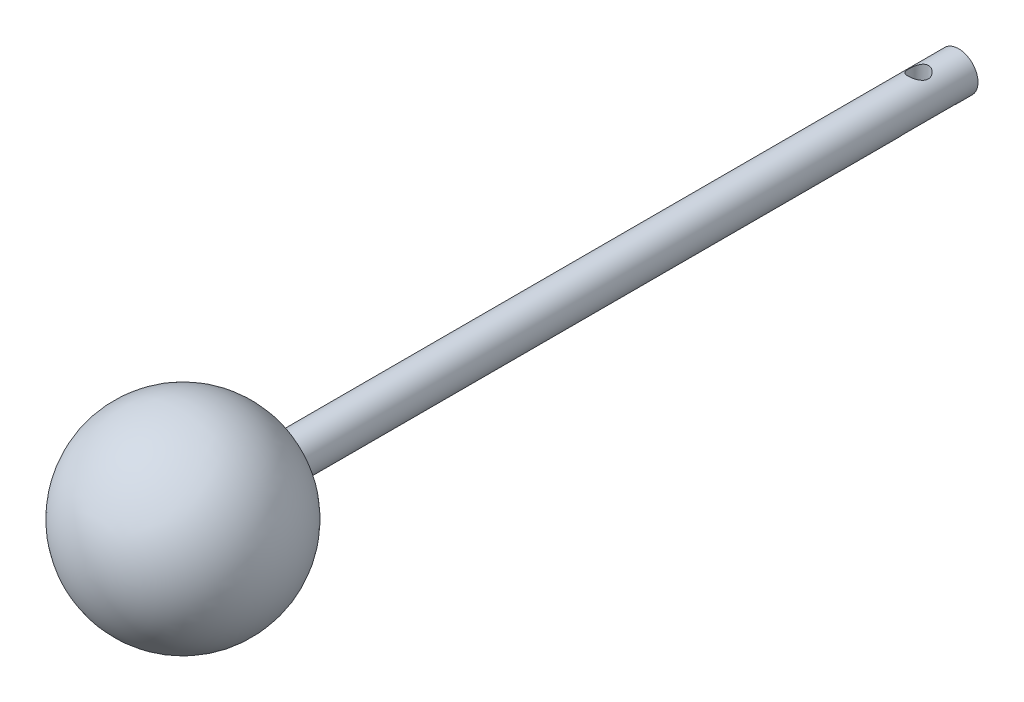
ISO-10303-21;
HEADER;
FILE_DESCRIPTION(('STEP AP214'),'2;1');
FILE_NAME('part.step','',(''),(''),'','','');
FILE_SCHEMA(('AUTOMOTIVE_DESIGN { 1 0 10303 214 1 1 1 1 }'));
ENDSEC;
DATA;
#1=APPLICATION_CONTEXT('core data for automotive mechanical design processes');
#2=APPLICATION_PROTOCOL_DEFINITION('international standard','automotive_design',2000,#1);
#3=PRODUCT_CONTEXT('',#1,'mechanical');
#4=PRODUCT('Part','Part','',(#3));
#5=PRODUCT_RELATED_PRODUCT_CATEGORY('part','',(#4));
#6=PRODUCT_DEFINITION_FORMATION('','',#4);
#7=PRODUCT_DEFINITION_CONTEXT('part definition',#1,'design');
#8=PRODUCT_DEFINITION('design','',#6,#7);
#9=PRODUCT_DEFINITION_SHAPE('','',#8);
#10=(LENGTH_UNIT() NAMED_UNIT(*) SI_UNIT(.MILLI.,.METRE.));
#11=(NAMED_UNIT(*) PLANE_ANGLE_UNIT() SI_UNIT($,.RADIAN.));
#12=(NAMED_UNIT(*) SI_UNIT($,.STERADIAN.) SOLID_ANGLE_UNIT());
#13=UNCERTAINTY_MEASURE_WITH_UNIT(LENGTH_MEASURE(1.E-05),#10,'distance_accuracy_value','');
#14=(GEOMETRIC_REPRESENTATION_CONTEXT(3) GLOBAL_UNCERTAINTY_ASSIGNED_CONTEXT((#13)) GLOBAL_UNIT_ASSIGNED_CONTEXT((#10,
#11,#12)) REPRESENTATION_CONTEXT('',''));
#15=CARTESIAN_POINT('',(0.,0.,0.));
#16=DIRECTION('',(0.,0.,1.));
#17=DIRECTION('',(1.,0.,0.));
#18=AXIS2_PLACEMENT_3D('',#15,#16,#17);
#19=CARTESIAN_POINT('',(-4.74113189811159,-3.,3.96323828942932));
#20=DIRECTION('',(0.,0.,-1.));
#21=DIRECTION('',(0.,-1.,0.));
#22=AXIS2_PLACEMENT_3D('',#19,#20,#21);
#23=PLANE('',#22);
#24=DIRECTION('',(1.,0.,0.));
#25=VECTOR('',#24,1.);
#26=CARTESIAN_POINT('',(-4.74113189811159,-3.,3.96323828942932));
#27=LINE('',#26,#25);
#28=CARTESIAN_POINT('',(-4.,-3.,3.96323828942932));
#29=VERTEX_POINT('',#28);
#30=CARTESIAN_POINT('',(4.,-3.,3.96323828942932));
#31=VERTEX_POINT('',#30);
#32=EDGE_CURVE('E10',#29,#31,#27,.T.);
#33=ORIENTED_EDGE('',*,*,#32,.F.);
#34=CARTESIAN_POINT('',(0.,0.,3.96323828942932));
#35=DIRECTION('',(0.,0.,1.));
#36=DIRECTION('',(-1.,0.,0.));
#37=AXIS2_PLACEMENT_3D('',#34,#35,#36);
#38=CIRCLE('',#37,5.);
#39=EDGE_CURVE('E78',#29,#31,#38,.T.);
#40=ORIENTED_EDGE('',*,*,#39,.T.);
#41=EDGE_LOOP('',(#33,#40));
#42=FACE_BOUND('',#41,.T.);
#43=ADVANCED_FACE('F16',(#42),#23,.F.);
#44=CARTESIAN_POINT('',(4.87669310872114,-3.,18.7551714697627));
#45=DIRECTION('',(0.,0.,1.));
#46=DIRECTION('',(1.,0.,0.));
#47=AXIS2_PLACEMENT_3D('',#44,#45,#46);
#48=PLANE('',#47);
#49=CARTESIAN_POINT('',(0.,0.,18.7551714697627));
#50=DIRECTION('',(0.,0.,-1.));
#51=DIRECTION('',(1.,0.,0.));
#52=AXIS2_PLACEMENT_3D('',#49,#50,#51);
#53=CIRCLE('',#52,5.);
#54=CARTESIAN_POINT('',(4.,-3.,18.7551714697627));
#55=VERTEX_POINT('',#54);
#56=CARTESIAN_POINT('',(-4.,-3.,18.7551714697627));
#57=VERTEX_POINT('',#56);
#58=EDGE_CURVE('E80',#55,#57,#53,.T.);
#59=ORIENTED_EDGE('',*,*,#58,.T.);
#60=DIRECTION('',(-1.,0.,0.));
#61=VECTOR('',#60,1.);
#62=CARTESIAN_POINT('',(4.87669310872114,-3.,18.7551714697627));
#63=LINE('',#62,#61);
#64=EDGE_CURVE('E29',#55,#57,#63,.T.);
#65=ORIENTED_EDGE('',*,*,#64,.F.);
#66=EDGE_LOOP('',(#59,#65));
#67=FACE_BOUND('',#66,.T.);
#68=ADVANCED_FACE('F81',(#67),#48,.F.);
#69=CARTESIAN_POINT('',(0.,-3.,0.));
#70=DIRECTION('',(0.,-1.,0.));
#71=DIRECTION('',(0.,0.,-1.));
#72=AXIS2_PLACEMENT_3D('',#69,#70,#71);
#73=PLANE('',#72);
#74=CARTESIAN_POINT('',(-0.273544519554993,-3.,10.1273674912475));
#75=DIRECTION('',(0.,1.,0.));
#76=DIRECTION('',(-1.,0.,0.));
#77=AXIS2_PLACEMENT_3D('',#74,#75,#76);
#78=ELLIPSE('',#77,2.50009360226849,2.5);
#79=CARTESIAN_POINT('',(-2.77363812182348,-3.,10.1273674912475));
#80=VERTEX_POINT('',#79);
#81=EDGE_CURVE('E97',#80,#80,#78,.T.);
#82=ORIENTED_EDGE('',*,*,#81,.T.);
#83=EDGE_LOOP('',(#82));
#84=FACE_BOUND('',#83,.T.);
#85=ORIENTED_EDGE('',*,*,#64,.T.);
#86=DIRECTION('',(0.,0.,1.));
#87=VECTOR('',#86,1.);
#88=CARTESIAN_POINT('',(-4.,-3.,-20.));
#89=LINE('',#88,#87);
#90=EDGE_CURVE('E72',#29,#57,#89,.T.);
#91=ORIENTED_EDGE('',*,*,#90,.F.);
#92=ORIENTED_EDGE('',*,*,#32,.T.);
#93=DIRECTION('',(0.,0.,-1.));
#94=VECTOR('',#93,1.);
#95=CARTESIAN_POINT('',(4.,-3.,-20.));
#96=LINE('',#95,#94);
#97=EDGE_CURVE('E74',#55,#31,#96,.T.);
#98=ORIENTED_EDGE('',*,*,#97,.F.);
#99=EDGE_LOOP('',(#85,#91,#92,#98));
#100=FACE_BOUND('',#99,.T.);
#101=ADVANCED_FACE('F18',(#84,#100),#73,.T.);
#102=CARTESIAN_POINT('',(0.,0.,-20.));
#103=DIRECTION('',(0.,0.,1.));
#104=DIRECTION('',(1.,0.,0.));
#105=AXIS2_PLACEMENT_3D('',#102,#103,#104);
#106=CYLINDRICAL_SURFACE('',#105,5.);
#107=CARTESIAN_POINT('',(0.,0.,175.505102572168));
#108=DIRECTION('',(0.,0.,1.));
#109=DIRECTION('',(1.,0.,0.));
#110=AXIS2_PLACEMENT_3D('',#107,#108,#109);
#111=CIRCLE('',#110,5.);
#112=CARTESIAN_POINT('',(5.,0.,175.505102572168));
#113=VERTEX_POINT('',#112);
#114=EDGE_CURVE('E87',#113,#113,#111,.T.);
#115=ORIENTED_EDGE('',*,*,#114,.F.);
#116=EDGE_LOOP('',(#115));
#117=FACE_BOUND('',#116,.T.);
#118=CARTESIAN_POINT('',(0.,0.,0.));
#119=DIRECTION('',(0.,0.,1.));
#120=DIRECTION('',(1.,0.,0.));
#121=AXIS2_PLACEMENT_3D('',#118,#119,#120);
#122=CIRCLE('',#121,5.);
#123=CARTESIAN_POINT('',(5.,0.,0.));
#124=VERTEX_POINT('',#123);
#125=EDGE_CURVE('E93',#124,#124,#122,.T.);
#126=ORIENTED_EDGE('',*,*,#125,.T.);
#127=EDGE_LOOP('',(#126));
#128=FACE_BOUND('',#127,.T.);
#129=CARTESIAN_POINT('',(2.29096807088509,4.44426206452619,10.1273674912475));
#130=CARTESIAN_POINT('',(2.29097027187872,4.44437638864499,10.0904048012969));
#131=CARTESIAN_POINT('',(2.29015475688964,4.4450003404971,10.0534461855536));
#132=CARTESIAN_POINT('',(2.28684216180662,4.44721746007607,9.97838359858996));
#133=CARTESIAN_POINT('',(2.28428933058905,4.44884258663657,9.9402830094962));
#134=CARTESIAN_POINT('',(2.27734172905094,4.45306227829104,9.86302563543784));
#135=CARTESIAN_POINT('',(2.27288861529391,4.45568723998433,9.82387578507373));
#136=CARTESIAN_POINT('',(2.26198158243105,4.46190995600956,9.74462277493384));
#137=CARTESIAN_POINT('',(2.25546706801254,4.46553668131556,9.70453023936022));
#138=CARTESIAN_POINT('',(2.24027908942118,4.47376647829459,9.62351213583029));
#139=CARTESIAN_POINT('',(2.23154305850821,4.47839714387939,9.58260111636345));
#140=CARTESIAN_POINT('',(2.21175622494379,4.48863381284672,9.50008259397428));
#141=CARTESIAN_POINT('',(2.20064118434847,4.49426594108972,9.45849373614737));
#142=CARTESIAN_POINT('',(2.17594671653291,4.50652299707374,9.37477821080143));
#143=CARTESIAN_POINT('',(2.16230176769901,4.51317321920018,9.33267461706599));
#144=CARTESIAN_POINT('',(2.13239679940392,4.52741099606083,9.24809168936194));
#145=CARTESIAN_POINT('',(2.11607010119879,4.53502083732476,9.20563958813183));
#146=CARTESIAN_POINT('',(2.08873837729159,4.54767834781354,9.13994971154055));
#147=CARTESIAN_POINT('',(2.07848254998998,4.55241214490316,9.11633632850894));
#148=CARTESIAN_POINT('',(2.05546291356246,4.562976251653,9.06549104912489));
#149=CARTESIAN_POINT('',(2.04256947479321,4.56885598685266,9.0383279335775));
#150=CARTESIAN_POINT('',(2.01388477010988,4.58169761049992,8.98060367758997));
#151=CARTESIAN_POINT('',(1.99794493110527,4.58869240068173,8.95012371959596));
#152=CARTESIAN_POINT('',(1.96273748497673,4.60378717978528,8.88605311771569));
#153=CARTESIAN_POINT('',(1.94330445394091,4.61191460865653,8.85255972636785));
#154=CARTESIAN_POINT('',(1.90064638400019,4.62928097181163,8.7828207136445));
#155=CARTESIAN_POINT('',(1.87724088672117,4.63854185067378,8.74669094582312));
#156=CARTESIAN_POINT('',(1.82614862397464,4.65818563063851,8.67211846945943));
#157=CARTESIAN_POINT('',(1.798268393081,4.66858708354079,8.63381272197418));
#158=CARTESIAN_POINT('',(1.75386933297298,4.68467201890571,8.57632126236301));
#159=CARTESIAN_POINT('',(1.73810189265203,4.69029824942895,8.55653423582525));
#160=CARTESIAN_POINT('',(1.70528639927766,4.70183691533213,8.51661374817765));
#161=CARTESIAN_POINT('',(1.68821243948283,4.70775124010688,8.49650207601029));
#162=CARTESIAN_POINT('',(1.6527229010513,4.71986156453604,8.45601762125972));
#163=CARTESIAN_POINT('',(1.63428103617855,4.72605911014308,8.43566835378258));
#164=CARTESIAN_POINT('',(1.5959997952171,4.73875606425283,8.39480387639068));
#165=CARTESIAN_POINT('',(1.57613400131619,4.74525769646351,8.37431409256095));
#166=CARTESIAN_POINT('',(1.53777789007654,4.75757383234399,8.33608880792879));
#167=CARTESIAN_POINT('',(1.51935513923773,4.76339049773061,8.31828617699927));
#168=CARTESIAN_POINT('',(1.4824762922704,4.77476888870651,8.28373331581397));
#169=CARTESIAN_POINT('',(1.46403549038959,4.78033319782421,8.26696758003004));
#170=CARTESIAN_POINT('',(1.4095609163737,4.79643115559803,8.21891562299686));
#171=CARTESIAN_POINT('',(1.37284739469889,4.8068600403643,8.18835855627408));
#172=CARTESIAN_POINT('',(1.29991703669441,4.82673691565651,8.13113045286886));
#173=CARTESIAN_POINT('',(1.26380236560522,4.83620622983469,8.10433627125596));
#174=CARTESIAN_POINT('',(1.19245449803386,4.85416172486003,8.05434316267399));
#175=CARTESIAN_POINT('',(1.15731171656263,4.86267210638991,8.03102393935415));
#176=CARTESIAN_POINT('',(1.08824433431877,4.87870349946571,7.98768313399319));
#177=CARTESIAN_POINT('',(1.05439923817867,4.88625244366949,7.96754514612932));
#178=CARTESIAN_POINT('',(0.988215223418597,4.90035155557564,7.93026560462086));
#179=CARTESIAN_POINT('',(0.955946013706783,4.90693442644957,7.91301263896047));
#180=CARTESIAN_POINT('',(0.893159860872016,4.91910481668146,7.88120596743481));
#181=CARTESIAN_POINT('',(0.86270373675081,4.92472991122281,7.86654668575605));
#182=CARTESIAN_POINT('',(0.803745754480453,4.93494192289116,7.83963655047852));
#183=CARTESIAN_POINT('',(0.775297185226141,4.93957642716842,7.82728687764598));
#184=CARTESIAN_POINT('',(0.706945724162001,4.94998065001827,7.79912427935863));
#185=CARTESIAN_POINT('',(0.666809611499359,4.95550984223701,7.78378527450628));
#186=CARTESIAN_POINT('',(0.586199507854663,4.96561456201617,7.75534961738333));
#187=CARTESIAN_POINT('',(0.54573580366146,4.97020101929393,7.74222762235487));
#188=CARTESIAN_POINT('',(0.464591068621443,4.97837673589085,7.71819392887311));
#189=CARTESIAN_POINT('',(0.423918501121329,4.98197732250385,7.70725755077625));
#190=CARTESIAN_POINT('',(0.342480749205181,4.98819157723667,7.68756010707831));
#191=CARTESIAN_POINT('',(0.301722187372839,4.99081627458129,7.67877514021755));
#192=CARTESIAN_POINT('',(0.22022938307357,4.99507496124411,7.66333830308543));
#193=CARTESIAN_POINT('',(0.179500059918453,4.99671979967076,7.65666347289277));
#194=CARTESIAN_POINT('',(0.0981777185691262,4.99901892274448,7.645399249595));
#195=CARTESIAN_POINT('',(0.0575880321116918,4.99968378153604,7.64078797408039));
#196=CARTESIAN_POINT('',(-0.023348886374839,5.00002174400196,7.63359792781819));
#197=CARTESIAN_POINT('',(-0.0636942375815496,4.99970510976384,7.630998478676));
#198=CARTESIAN_POINT('',(-0.144042478576137,4.99808100147773,7.62777451322916));
#199=CARTESIAN_POINT('',(-0.184044788466749,4.99678340266519,7.627130632565));
#200=CARTESIAN_POINT('',(-0.26331707943675,4.99320517096368,7.62775361926741));
#201=CARTESIAN_POINT('',(-0.302588079419665,4.99094140915315,7.62898858643345));
#202=CARTESIAN_POINT('',(-0.381600041078189,4.98543144533972,7.63333334837346));
#203=CARTESIAN_POINT('',(-0.421338269045822,4.98216987579663,7.63647328432323));
#204=CARTESIAN_POINT('',(-0.501189609093607,4.97466479607194,7.64470000659985));
#205=CARTESIAN_POINT('',(-0.541298040393421,4.97040592746277,7.64981815466014));
#206=CARTESIAN_POINT('',(-0.621787425057906,4.96090516564412,7.66206938193969));
#207=CARTESIAN_POINT('',(-0.662161630563923,4.95564795493803,7.66923487778318));
#208=CARTESIAN_POINT('',(-0.743072681884366,4.94414883999293,7.68564419694431));
#209=CARTESIAN_POINT('',(-0.783600602225478,4.937891700514,7.69492131465682));
#210=CARTESIAN_POINT('',(-0.864702855641782,4.92439439850425,7.71561244546104));
#211=CARTESIAN_POINT('',(-0.905266007942056,4.91713918518987,7.72706045416711));
#212=CARTESIAN_POINT('',(-0.98631196427087,4.90163363855943,7.7521444462965));
#213=CARTESIAN_POINT('',(-1.0267811939483,4.89336823894978,7.76581490870625));
#214=CARTESIAN_POINT('',(-1.10751866137676,4.8758825798655,7.79539430601673));
#215=CARTESIAN_POINT('',(-1.14777109404844,4.86664818534067,7.8113381120341));
#216=CARTESIAN_POINT('',(-1.21498121535791,4.85022076781346,7.83997994990063));
#217=CARTESIAN_POINT('',(-1.24221848486375,4.84327396517133,7.85216707805984));
#218=CARTESIAN_POINT('',(-1.29892288286051,4.82822522961965,7.87875617326114));
#219=CARTESIAN_POINT('',(-1.32833166554534,4.82007794066709,7.89325705682468));
#220=CARTESIAN_POINT('',(-1.38919254084527,4.80264653575239,7.92475689461217));
#221=CARTESIAN_POINT('',(-1.42057922230812,4.79332728084682,7.94186268710749));
#222=CARTESIAN_POINT('',(-1.48516429414427,4.77353470754872,7.97886509197857));
#223=CARTESIAN_POINT('',(-1.51828827256743,4.76303082657145,7.99887527677607));
#224=CARTESIAN_POINT('',(-1.58607550134313,4.74086545916053,8.04198809252145));
#225=CARTESIAN_POINT('',(-1.62065431225753,4.72917798376498,8.06521015530437));
#226=CARTESIAN_POINT('',(-1.69102944269022,4.70463385102973,8.11504854818224));
#227=CARTESIAN_POINT('',(-1.72672992954157,4.69175418779594,8.14178890955388));
#228=CARTESIAN_POINT('',(-1.79897952699599,4.66483678735649,8.19896511909566));
#229=CARTESIAN_POINT('',(-1.83542055637113,4.65077996189387,8.22952862248566));
#230=CARTESIAN_POINT('',(-1.90870805551039,4.62143111212679,8.29461909345997));
#231=CARTESIAN_POINT('',(-1.94543181590927,4.60611753192481,8.32927452672471));
#232=CARTESIAN_POINT('',(-2.01824309001192,4.57480427274336,8.40225611521151));
#233=CARTESIAN_POINT('',(-2.05423629224352,4.55880324906413,8.44067585825698));
#234=CARTESIAN_POINT('',(-2.12136739178042,4.52823089758408,8.51702087136553));
#235=CARTESIAN_POINT('',(-2.15266883661614,4.5136376983926,8.5547936927238));
#236=CARTESIAN_POINT('',(-2.21078331929939,4.48580259497332,8.62927467414137));
#237=CARTESIAN_POINT('',(-2.23775692553242,4.4725413957942,8.66585040166208));
#238=CARTESIAN_POINT('',(-2.28761879477652,4.4473979032831,8.7374690168262));
#239=CARTESIAN_POINT('',(-2.31066099827371,4.435490921203,8.77239611457193));
#240=CARTESIAN_POINT('',(-2.35306042579697,4.41305715542778,8.84031663103857));
#241=CARTESIAN_POINT('',(-2.37256346025103,4.40250117764058,8.87320941025943));
#242=CARTESIAN_POINT('',(-2.40827894534333,4.38278478685676,8.93672927209357));
#243=CARTESIAN_POINT('',(-2.4246273188275,4.37358800360464,8.96726867692386));
#244=CARTESIAN_POINT('',(-2.45440962132872,4.35658350043946,9.02580421445821));
#245=CARTESIAN_POINT('',(-2.46796840563817,4.34873226334206,9.05372408537773));
#246=CARTESIAN_POINT('',(-2.49252992339022,4.33448529821161,9.10680848345417));
#247=CARTESIAN_POINT('',(-2.50364466818968,4.32802763998937,9.1319046402947));
#248=CARTESIAN_POINT('',(-2.53144675002812,4.31188092610146,9.1976014819507));
#249=CARTESIAN_POINT('',(-2.54752034074956,4.30255218535489,9.23855293335427));
#250=CARTESIAN_POINT('',(-2.57719116918176,4.28509656647381,9.32048492226621));
#251=CARTESIAN_POINT('',(-2.5908368448043,4.27694698720009,9.36144314429686));
#252=CARTESIAN_POINT('',(-2.61574099260299,4.26192293182004,9.44325404152996));
#253=CARTESIAN_POINT('',(-2.62704701619136,4.25502350890644,9.48408761425698));
#254=CARTESIAN_POINT('',(-2.64735933409088,4.24248256004535,9.56550341164948));
#255=CARTESIAN_POINT('',(-2.65641217091498,4.23681594804021,9.60607015275378));
#256=CARTESIAN_POINT('',(-2.67231411177896,4.22674676140041,9.68682340871795));
#257=CARTESIAN_POINT('',(-2.67920837951855,4.22231852325495,9.72699781045202));
#258=CARTESIAN_POINT('',(-2.6908937352339,4.21472625090517,9.80684711727806));
#259=CARTESIAN_POINT('',(-2.6957283126412,4.21153621698888,9.84651317059802));
#260=CARTESIAN_POINT('',(-2.70339917595879,4.20642151780614,9.92523776162635));
#261=CARTESIAN_POINT('',(-2.70627697606141,4.20447062663193,9.96429053515205));
#262=CARTESIAN_POINT('',(-2.71014235919959,4.20183660616126,10.041691440902));
#263=CARTESIAN_POINT('',(-2.71116920002661,4.20112715637405,10.0800366992115));
#264=CARTESIAN_POINT('',(-2.71144706277495,4.20096985269273,10.1570031544269));
#265=CARTESIAN_POINT('',(-2.7106856771221,4.20153081254668,10.1956244146287));
#266=CARTESIAN_POINT('',(-2.707331816848,4.2038739270316,10.27356869332));
#267=CARTESIAN_POINT('',(-2.70470094354513,4.20568166681373,10.3128892717578));
#268=CARTESIAN_POINT('',(-2.69750611579064,4.2105186862893,10.3921400292606));
#269=CARTESIAN_POINT('',(-2.69290147825547,4.21357360585944,10.4320649366185));
#270=CARTESIAN_POINT('',(-2.68165991055768,4.22090345711632,10.5124217672246));
#271=CARTESIAN_POINT('',(-2.67498029107071,4.22520387361731,10.5528453788687));
#272=CARTESIAN_POINT('',(-2.65949340194463,4.23502541055828,10.6340863107904));
#273=CARTESIAN_POINT('',(-2.65064173556476,4.24057176699779,10.6748920981385));
#274=CARTESIAN_POINT('',(-2.63071946301245,4.25287987285514,10.7567749141856));
#275=CARTESIAN_POINT('',(-2.61960304759152,4.25966635397161,10.7978370728223));
#276=CARTESIAN_POINT('',(-2.5950678836595,4.27447293497336,10.8800937907121));
#277=CARTESIAN_POINT('',(-2.5816022825848,4.28251770457349,10.9212698887743));
#278=CARTESIAN_POINT('',(-2.55228340943907,4.29976910127893,11.003626841033));
#279=CARTESIAN_POINT('',(-2.5363823672122,4.30899818513593,11.0447860470026));
#280=CARTESIAN_POINT('',(-2.50877818339439,4.32504151077424,11.1109869314259));
#281=CARTESIAN_POINT('',(-2.49768915307287,4.33149133426336,11.1363754157407));
#282=CARTESIAN_POINT('',(-2.47318525733593,4.34572928607096,11.1900329857457));
#283=CARTESIAN_POINT('',(-2.45965759213139,4.35358108678266,11.2182337364967));
#284=CARTESIAN_POINT('',(-2.42994189831535,4.37059151376138,11.2773201258799));
#285=CARTESIAN_POINT('',(-2.41362834467549,4.37979497734012,11.3081296260927));
#286=CARTESIAN_POINT('',(-2.37798552762949,4.39953035273281,11.3721789238253));
#287=CARTESIAN_POINT('',(-2.35851978315314,4.41009983251106,11.4053312301168));
#288=CARTESIAN_POINT('',(-2.31619694374286,4.43256618009679,11.4737604137246));
#289=CARTESIAN_POINT('',(-2.29319357836316,4.44449326813821,11.5089369247761));
#290=CARTESIAN_POINT('',(-2.24341071992669,4.46968279174129,11.5810443937181));
#291=CARTESIAN_POINT('',(-2.21647691385014,4.48297081826416,11.6178599252527));
#292=CARTESIAN_POINT('',(-2.15844295941337,4.51086531631228,11.6928111738383));
#293=CARTESIAN_POINT('',(-2.12718194625725,4.52549187166096,11.7308149217926));
#294=CARTESIAN_POINT('',(-2.06013258796014,4.55613746157326,11.8076130232298));
#295=CARTESIAN_POINT('',(-2.02418045921212,4.57217907792735,11.8462554897636));
#296=CARTESIAN_POINT('',(-1.95149371014832,4.6035530378374,11.9196054785906));
#297=CARTESIAN_POINT('',(-1.91485789673842,4.61888644566769,11.9544105406946));
#298=CARTESIAN_POINT('',(-1.84174480934777,4.64827486559829,12.0197822883608));
#299=CARTESIAN_POINT('',(-1.80539143739123,4.6623511776615,12.050477995976));
#300=CARTESIAN_POINT('',(-1.73331944789457,4.68930807873343,12.1079017707147));
#301=CARTESIAN_POINT('',(-1.69770993564593,4.70220741248418,12.1347580438378));
#302=CARTESIAN_POINT('',(-1.62752217942644,4.72679135575201,12.1848129167677));
#303=CARTESIAN_POINT('',(-1.59304064880744,4.73849860867282,12.2081360492228));
#304=CARTESIAN_POINT('',(-1.52545604134568,4.76070404926784,12.2514371100514));
#305=CARTESIAN_POINT('',(-1.49243815300388,4.77122782621567,12.2715349083236));
#306=CARTESIAN_POINT('',(-1.4280755270593,4.79106087768269,12.3087000093134));
#307=CARTESIAN_POINT('',(-1.3968058334344,4.80040027181659,12.3258812414512));
#308=CARTESIAN_POINT('',(-1.33619091285093,4.8178722896045,12.3575206526372));
#309=CARTESIAN_POINT('',(-1.30691163487286,4.82603960023492,12.372085929554));
#310=CARTESIAN_POINT('',(-1.2504799056716,4.84113011953928,12.398793397049));
#311=CARTESIAN_POINT('',(-1.2233862414284,4.84809810769962,12.4110346592366));
#312=CARTESIAN_POINT('',(-1.15647864266818,4.86459763862121,12.4398406237863));
#313=CARTESIAN_POINT('',(-1.11638397791971,4.87388547857944,12.4558967845562));
#314=CARTESIAN_POINT('',(-1.03596631915964,4.8914796276272,12.4857085949943));
#315=CARTESIAN_POINT('',(-0.995659465487342,4.89980021485419,12.4994994427865));
#316=CARTESIAN_POINT('',(-0.914942618177342,4.91541943439404,12.524832840734));
#317=CARTESIAN_POINT('',(-0.8745465177544,4.92273327851046,12.5364102126708));
#318=CARTESIAN_POINT('',(-0.793782308136336,4.93635066102151,12.5573697146252));
#319=CARTESIAN_POINT('',(-0.753425683817205,4.94266942160353,12.5667861982578));
#320=CARTESIAN_POINT('',(-0.672860753482689,4.95429469731484,12.5834848234153));
#321=CARTESIAN_POINT('',(-0.632661659929774,4.95961664052408,12.5908006321296));
#322=CARTESIAN_POINT('',(-0.552525500870436,4.96924970486144,12.6033639406714));
#323=CARTESIAN_POINT('',(-0.51259545139969,4.9735763608432,12.6086442440067));
#324=CARTESIAN_POINT('',(-0.433103275930472,4.9812199093646,12.6172075471284));
#325=CARTESIAN_POINT('',(-0.393546077933514,4.98455240098403,12.6205223086699));
#326=CARTESIAN_POINT('',(-0.314897911371472,4.99020678641961,12.6252297418584));
#327=CARTESIAN_POINT('',(-0.275809900373073,4.99254431907547,12.6266529664705));
#328=CARTESIAN_POINT('',(-0.196698661437882,4.99628618425719,12.6276753280992));
#329=CARTESIAN_POINT('',(-0.156673863367863,4.99766874199134,12.6272334405602));
#330=CARTESIAN_POINT('',(-0.0762448628294286,4.99946266764922,12.6244124177332));
#331=CARTESIAN_POINT('',(-0.0358411501798059,4.9998635551561,12.6220127385772));
#332=CARTESIAN_POINT('',(0.0452481245615797,4.99969371219298,12.6152168752265));
#333=CARTESIAN_POINT('',(0.0859318280746115,4.99911213309128,12.6107987971928));
#334=CARTESIAN_POINT('',(0.167477205266127,4.9969791856403,12.5999112399802));
#335=CARTESIAN_POINT('',(0.208335497621286,4.99541668180254,12.5934186320278));
#336=CARTESIAN_POINT('',(0.290120234950567,4.991322458793,12.5783321014517));
#337=CARTESIAN_POINT('',(0.331041637003667,4.98877935738897,12.5697139467485));
#338=CARTESIAN_POINT('',(0.412837446323731,4.98272726692455,12.5503316627873));
#339=CARTESIAN_POINT('',(0.453705029159681,4.97920673480297,12.5395423404351));
#340=CARTESIAN_POINT('',(0.535270696782066,4.97119317549172,12.5157797778257));
#341=CARTESIAN_POINT('',(0.575960042119075,4.96668836888498,12.5027805494687));
#342=CARTESIAN_POINT('',(0.657048106971273,4.95673728010646,12.4745639731451));
#343=CARTESIAN_POINT('',(0.697436162464202,4.95127951432778,12.4593199734087));
#344=CARTESIAN_POINT('',(0.76772390203961,4.94080715981318,12.4306893440511));
#345=CARTESIAN_POINT('',(0.797827884127191,4.93599727784108,12.4177267306037));
#346=CARTESIAN_POINT('',(0.859648428917972,4.92547758041497,12.389651863104));
#347=CARTESIAN_POINT('',(0.891318119515467,4.9197274207697,12.374451412299));
#348=CARTESIAN_POINT('',(0.956093184914492,4.90734549994188,12.3416620446072));
#349=CARTESIAN_POINT('',(0.989145248019993,4.90068023886285,12.3239805402573));
#350=CARTESIAN_POINT('',(1.05647432348215,4.88645875270805,12.2859878063828));
#351=CARTESIAN_POINT('',(1.09069071946441,4.87887277123118,12.2655802859316));
#352=CARTESIAN_POINT('',(1.16010479769606,4.8628099264477,12.2218940502287));
#353=CARTESIAN_POINT('',(1.19523393818926,4.85430695932385,12.1985160021181));
#354=CARTESIAN_POINT('',(1.2661925364585,4.83640978803163,12.1486526315342));
#355=CARTESIAN_POINT('',(1.30194478159442,4.8269924864965,12.1220657714227));
#356=CARTESIAN_POINT('',(1.37383233944799,4.80726299284651,12.0655562460393));
#357=CARTESIAN_POINT('',(1.4098812316285,4.79693004309558,12.0355306144199));
#358=CARTESIAN_POINT('',(1.46328214624004,4.78097625806292,11.9884406216075));
#359=CARTESIAN_POINT('',(1.48129602999319,4.77547660098341,11.972079705924));
#360=CARTESIAN_POINT('',(1.51726588928025,4.76423727494582,11.9384365825663));
#361=CARTESIAN_POINT('',(1.5352091021282,4.75849504504712,11.9211415621636));
#362=CARTESIAN_POINT('',(1.57436067700176,4.74575027592798,11.8822555621725));
#363=CARTESIAN_POINT('',(1.59544298917646,4.73874183325504,11.8605394485846));
#364=CARTESIAN_POINT('',(1.63590596531779,4.72508974843324,11.8173125158663));
#365=CARTESIAN_POINT('',(1.6553207150648,4.71844357545881,11.7958343806151));
#366=CARTESIAN_POINT('',(1.6925236143481,4.70549056496904,11.7532082922636));
#367=CARTESIAN_POINT('',(1.71034553470874,4.69918213126152,11.7320902950849));
#368=CARTESIAN_POINT('',(1.7444450956267,4.68691030152527,11.6902943485122));
#369=CARTESIAN_POINT('',(1.76075579755044,4.68094488200496,11.6696439551385));
#370=CARTESIAN_POINT('',(1.79191546043283,4.66935689625958,11.628883993613));
#371=CARTESIAN_POINT('',(1.80679665501559,4.66373221229572,11.6087996764915));
#372=CARTESIAN_POINT('',(1.8351799010553,4.65282581209281,11.5692638862151));
#373=CARTESIAN_POINT('',(1.84871322348057,4.64754174667235,11.5498354566157));
#374=CARTESIAN_POINT('',(1.88625328198731,4.63264520066817,11.4942727168712));
#375=CARTESIAN_POINT('',(1.90961077869833,4.62308739334103,11.4576814925116));
#376=CARTESIAN_POINT('',(1.95166499941043,4.60534573749843,11.3878477082422));
#377=CARTESIAN_POINT('',(1.97058221000238,4.59713695994364,11.3547437673884));
#378=CARTESIAN_POINT('',(2.00437194149873,4.58210249938325,11.2923368375401));
#379=CARTESIAN_POINT('',(2.01944053517435,4.575243639993,11.2631479491897));
#380=CARTESIAN_POINT('',(2.04608848956326,4.56288549254131,11.2089307747869));
#381=CARTESIAN_POINT('',(2.05783749752174,4.55734604966053,11.1839950679989));
#382=CARTESIAN_POINT('',(2.07834244718003,4.54771476534994,11.1385414859787));
#383=CARTESIAN_POINT('',(2.08723782647075,4.543550137765,11.1181017741222));
#384=CARTESIAN_POINT('',(2.11319290502272,4.53146121900445,11.056212244567));
#385=CARTESIAN_POINT('',(2.12945136289533,4.52397520363767,11.0143370002695));
#386=CARTESIAN_POINT('',(2.159356026922,4.50995147038274,10.9306948886832));
#387=CARTESIAN_POINT('',(2.17305639506467,4.50339503800549,10.8889504172772));
#388=CARTESIAN_POINT('',(2.19796431929767,4.49135330838671,10.80571434001));
#389=CARTESIAN_POINT('',(2.2092250910173,4.48584555345079,10.7642419578776));
#390=CARTESIAN_POINT('',(2.22936666955869,4.47586924112443,10.6817094470704));
#391=CARTESIAN_POINT('',(2.23829979019718,4.47137820807991,10.6406647979279));
#392=CARTESIAN_POINT('',(2.2539085730697,4.46344325471653,10.5591252016663));
#393=CARTESIAN_POINT('',(2.26063527848709,4.45997587720669,10.5186423230268));
#394=CARTESIAN_POINT('',(2.27195767448213,4.45408595165234,10.4383517860857));
#395=CARTESIAN_POINT('',(2.27660288858819,4.4516392303436,10.3985528919691));
#396=CARTESIAN_POINT('',(2.28389184090018,4.44779037978538,10.3197412288562));
#397=CARTESIAN_POINT('',(2.28658333766968,4.44636333917771,10.2807341116256));
#398=CARTESIAN_POINT('',(2.29009879913498,4.44455490925125,10.2036055665059));
#399=CARTESIAN_POINT('',(2.29096846320176,4.44414788077678,10.1654868082574));
#400=CARTESIAN_POINT('',(2.29096807088509,4.44426206452619,10.1273674912475));
#401=B_SPLINE_CURVE_WITH_KNOTS('',3,(#129,#130,#131,#132,#133,#134,#135,#136,#137,#138,#139,
#140,#141,#142,#143,#144,#145,#146,#147,#148,#149,#150,#151,#152,#153,#154,#155,#156,#157,#158,
#159,#160,#161,#162,#163,#164,#165,#166,#167,#168,#169,#170,#171,#172,#173,#174,#175,#176,#177,
#178,#179,#180,#181,#182,#183,#184,#185,#186,#187,#188,#189,#190,#191,#192,#193,#194,#195,#196,
#197,#198,#199,#200,#201,#202,#203,#204,#205,#206,#207,#208,#209,#210,#211,#212,#213,#214,#215,
#216,#217,#218,#219,#220,#221,#222,#223,#224,#225,#226,#227,#228,#229,#230,#231,#232,#233,#234,
#235,#236,#237,#238,#239,#240,#241,#242,#243,#244,#245,#246,#247,#248,#249,#250,#251,#252,#253,
#254,#255,#256,#257,#258,#259,#260,#261,#262,#263,#264,#265,#266,#267,#268,#269,#270,#271,#272,
#273,#274,#275,#276,#277,#278,#279,#280,#281,#282,#283,#284,#285,#286,#287,#288,#289,#290,#291,
#292,#293,#294,#295,#296,#297,#298,#299,#300,#301,#302,#303,#304,#305,#306,#307,#308,#309,#310,
#311,#312,#313,#314,#315,#316,#317,#318,#319,#320,#321,#322,#323,#324,#325,#326,#327,#328,#329,
#330,#331,#332,#333,#334,#335,#336,#337,#338,#339,#340,#341,#342,#343,#344,#345,#346,#347,#348,
#349,#350,#351,#352,#353,#354,#355,#356,#357,#358,#359,#360,#361,#362,#363,#364,#365,#366,#367,
#368,#369,#370,#371,#372,#373,#374,#375,#376,#377,#378,#379,#380,#381,#382,#383,#384,#385,#386,
#387,#388,#389,#390,#391,#392,#393,#394,#395,#396,#397,#398,#399,#400),.UNSPECIFIED.,.F.,.F.,(4,
2,2,2,2,2,2,2,2,2,2,2,2,2,2,2,2,2,2,2,2,2,2,2,2,2,2,2,2,2,2,2,2,2,2,2,2,2,2,2,2,2,2,2,2,2,2,2,2,
2,2,2,2,2,2,2,2,2,2,2,2,2,2,2,2,2,2,2,2,2,2,2,2,2,2,2,2,2,2,2,2,2,2,2,2,2,2,2,2,2,2,2,2,2,2,2,2,
2,2,2,2,2,2,2,2,2,2,2,2,2,2,2,2,2,2,2,2,2,2,2,2,2,2,2,2,2,2,2,2,2,2,2,2,2,2,4),(0.,
0.11087256235732,0.225482112978338,0.34389703585213,0.466179323471057,0.592385262077772,
0.722566041199773,0.856768294603893,0.995034579699853,1.07355083366533,1.16544153138966,
1.27071343308551,1.38937072593305,1.52141603230207,1.66685095443393,1.74459840633999,
1.82569469589999,1.91013995453268,1.99793429357072,2.07673499356546,2.15333541282056,
2.29992414422218,2.43772514249891,2.56674737240715,2.68700186466143,2.79850235576618,
2.90126619745159,2.99531568320466,3.12520954846041,3.25349997399297,3.38024782389459,
3.50551621109747,3.62937051059037,3.75187836156966,3.87310965729426,3.9931365214585,
4.11114811845438,4.23107748981496,4.35299178311779,4.47695491969405,4.60302770375859,
4.73126793799404,4.86173054344677,4.99446768188276,5.08635998222038,5.18769161360728,
5.2984790084796,5.41873462901053,5.54846811417057,5.68768703909097,5.8363974336906,
5.99460414651959,6.1595740688967,6.31303653407787,6.45499565291893,6.58545684009678,
6.70442729946766,6.8119167679195,6.90793870196399,6.99251226437452,7.12734671565033,
7.25908116042364,7.38779586714248,7.51357688786278,7.63651643738614,7.75671327286848,
7.87427306606042,7.98930875837177,8.10514497911039,8.22343189156883,8.34428394407834,
8.4678084532166,8.59410592131514,8.72327037602255,8.85538972198264,8.99054609650321,
9.07586502874996,9.17258312207807,9.2807209607094,9.40029306829163,9.53131000108956,
9.67377960499238,9.82770780695217,9.99309913325094,10.1514349766759,10.3002138497708,
10.4394403440747,10.5691201855814,10.6892605862724,10.7998707464592,10.9009625924751,
10.992551894912,11.1250151888717,11.2551713096252,11.3830717826293,11.5087709080359,
11.6323258892103,11.7537969595533,11.8732475057957,11.9907441856214,12.1108386069832,
12.2322096853861,12.3549297502163,12.479068772525,12.6046943519865,12.7318717174072,
12.8606637394321,12.9911309540731,13.0904844867505,13.1972372540183,13.3114136273623,
13.433033464623,13.5621131373084,13.6986662826706,13.8427043639509,13.9175411148147,
13.9942531751154,14.0874347173303,14.1765341000845,14.2615513780073,14.3424866244476,
14.4193399349369,14.4921114316248,14.6253987689295,14.7423647367344,14.8430113168923,
14.9273424467801,14.9953657465405,15.1319049768504,15.2651049377551,15.3950147401271,
15.5216873257396,15.6451798039413,15.7655538144937,15.8828759165849,15.9972180032308),.UNSPECIFIED.);
#402=CARTESIAN_POINT('',(2.29096807088509,4.44426206452603,10.1273674912475));
#403=VERTEX_POINT('',#402);
#404=EDGE_CURVE('E105',#403,#403,#401,.T.);
#405=ORIENTED_EDGE('',*,*,#404,.F.);
#406=EDGE_LOOP('',(#405));
#407=FACE_BOUND('',#406,.T.);
#408=ORIENTED_EDGE('',*,*,#90,.T.);
#409=ORIENTED_EDGE('',*,*,#58,.F.);
#410=ORIENTED_EDGE('',*,*,#97,.T.);
#411=ORIENTED_EDGE('',*,*,#39,.F.);
#412=EDGE_LOOP('',(#408,#409,#410,#411));
#413=FACE_BOUND('',#412,.T.);
#414=ADVANCED_FACE('F85',(#117,#128,#407,#413),#106,.T.);
#415=CARTESIAN_POINT('',(0.,0.,200.));
#416=DIRECTION('',(0.,0.,1.));
#417=DIRECTION('',(-1.,0.,0.));
#418=AXIS2_PLACEMENT_3D('',#415,#416,#417);
#419=SPHERICAL_SURFACE('',#418,25.);
#420=ORIENTED_EDGE('',*,*,#114,.T.);
#421=EDGE_LOOP('',(#420));
#422=FACE_BOUND('',#421,.T.);
#423=ADVANCED_FACE('F121',(#422),#419,.T.);
#424=CARTESIAN_POINT('',(5.,0.,0.));
#425=DIRECTION('',(0.,0.,-1.));
#426=DIRECTION('',(0.,-1.,0.));
#427=AXIS2_PLACEMENT_3D('',#424,#425,#426);
#428=PLANE('',#427);
#429=ORIENTED_EDGE('',*,*,#125,.F.);
#430=EDGE_LOOP('',(#429));
#431=FACE_BOUND('',#430,.T.);
#432=ADVANCED_FACE('F119',(#431),#428,.T.);
#433=CARTESIAN_POINT('',(1.75001820648438,230.843027719068,10.1273674912475));
#434=DIRECTION('',(-0.00865318493601724,-0.999962560494373,0.));
#435=DIRECTION('',(0.999962560494373,-0.00865318493601724,0.));
#436=AXIS2_PLACEMENT_3D('',#433,#434,#435);
#437=CYLINDRICAL_SURFACE('',#436,2.5);
#438=ORIENTED_EDGE('',*,*,#81,.F.);
#439=EDGE_LOOP('',(#438));
#440=FACE_BOUND('',#439,.T.);
#441=ORIENTED_EDGE('',*,*,#404,.T.);
#442=EDGE_LOOP('',(#441));
#443=FACE_BOUND('',#442,.T.);
#444=ADVANCED_FACE('F109',(#440,#443),#437,.F.);
#445=CLOSED_SHELL('',(#43,#68,#101,#414,#423,#432,#444));
#446=MANIFOLD_SOLID_BREP('B1',#445);
#447=ADVANCED_BREP_SHAPE_REPRESENTATION('',(#18,#446),#14);
#448=SHAPE_DEFINITION_REPRESENTATION(#9,#447);
ENDSEC;
END-ISO-10303-21;
